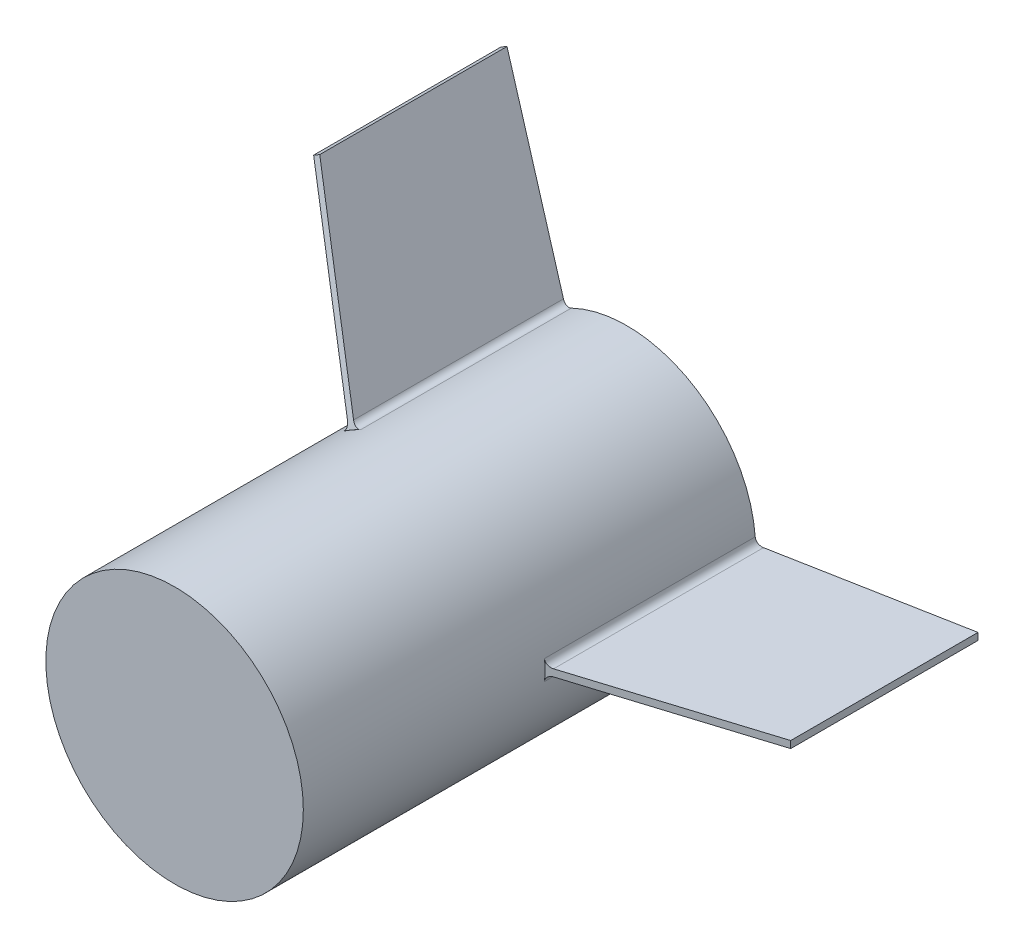
ISO-10303-21;
HEADER;
FILE_DESCRIPTION(('STEP AP214'),'2;1');
FILE_NAME('part.step','',(''),(''),'','','');
FILE_SCHEMA(('AUTOMOTIVE_DESIGN { 1 0 10303 214 1 1 1 1 }'));
ENDSEC;
DATA;
#1=APPLICATION_CONTEXT('core data for automotive mechanical design processes');
#2=APPLICATION_PROTOCOL_DEFINITION('international standard','automotive_design',2000,#1);
#3=PRODUCT_CONTEXT('',#1,'mechanical');
#4=PRODUCT('Part','Part','',(#3));
#5=PRODUCT_RELATED_PRODUCT_CATEGORY('part','',(#4));
#6=PRODUCT_DEFINITION_FORMATION('','',#4);
#7=PRODUCT_DEFINITION_CONTEXT('part definition',#1,'design');
#8=PRODUCT_DEFINITION('design','',#6,#7);
#9=PRODUCT_DEFINITION_SHAPE('','',#8);
#10=(LENGTH_UNIT() NAMED_UNIT(*) SI_UNIT(.MILLI.,.METRE.));
#11=(NAMED_UNIT(*) PLANE_ANGLE_UNIT() SI_UNIT($,.RADIAN.));
#12=(NAMED_UNIT(*) SI_UNIT($,.STERADIAN.) SOLID_ANGLE_UNIT());
#13=UNCERTAINTY_MEASURE_WITH_UNIT(LENGTH_MEASURE(1.E-05),#10,'distance_accuracy_value','');
#14=(GEOMETRIC_REPRESENTATION_CONTEXT(3) GLOBAL_UNCERTAINTY_ASSIGNED_CONTEXT((#13)) GLOBAL_UNIT_ASSIGNED_CONTEXT((#10,
#11,#12)) REPRESENTATION_CONTEXT('',''));
#15=CARTESIAN_POINT('',(0.,0.,0.));
#16=DIRECTION('',(0.,0.,1.));
#17=DIRECTION('',(1.,0.,0.));
#18=AXIS2_PLACEMENT_3D('',#15,#16,#17);
#19=CARTESIAN_POINT('',(0.,0.,190.));
#20=DIRECTION('',(0.,0.,-1.));
#21=DIRECTION('',(-1.,0.,0.));
#22=AXIS2_PLACEMENT_3D('',#19,#20,#21);
#23=CYLINDRICAL_SURFACE('',#22,55.);
#24=CARTESIAN_POINT('',(0.,0.,193.2));
#25=DIRECTION('',(0.,0.,1.));
#26=DIRECTION('',(1.,0.,0.));
#27=AXIS2_PLACEMENT_3D('',#24,#25,#26);
#28=CIRCLE('',#27,55.);
#29=CARTESIAN_POINT('',(55.,0.,193.2));
#30=VERTEX_POINT('',#29);
#31=EDGE_CURVE('E337',#30,#30,#28,.T.);
#32=ORIENTED_EDGE('',*,*,#31,.F.);
#33=EDGE_LOOP('',(#32));
#34=FACE_BOUND('',#33,.T.);
#35=CARTESIAN_POINT('',(0.,0.,0.));
#36=DIRECTION('',(0.,0.,1.));
#37=DIRECTION('',(1.,0.,0.));
#38=AXIS2_PLACEMENT_3D('',#35,#36,#37);
#39=CIRCLE('',#38,55.);
#40=CARTESIAN_POINT('',(-31.1126447334815,45.3541986776105,0.));
#41=VERTEX_POINT('',#40);
#42=CARTESIAN_POINT('',(-31.1126447334821,-45.3541986776101,0.));
#43=VERTEX_POINT('',#42);
#44=EDGE_CURVE('E368',#41,#43,#39,.T.);
#45=ORIENTED_EDGE('',*,*,#44,.T.);
#46=DIRECTION('',(0.,0.,-1.));
#47=VECTOR('',#46,1.);
#48=CARTESIAN_POINT('',(-31.1126447334821,-45.3541986776101,190.));
#49=LINE('',#48,#47);
#50=CARTESIAN_POINT('',(-31.1126447334821,-45.3541986776101,90.));
#51=VERTEX_POINT('',#50);
#52=EDGE_CURVE('E400',#43,#51,#49,.F.);
#53=ORIENTED_EDGE('',*,*,#52,.T.);
#54=CARTESIAN_POINT('',(0.,0.,90.));
#55=DIRECTION('',(0.,0.,-1.));
#56=DIRECTION('',(-1.,0.,0.));
#57=AXIS2_PLACEMENT_3D('',#54,#55,#56);
#58=CIRCLE('',#57,55.);
#59=CARTESIAN_POINT('',(-27.5000000000002,-47.631397208144,90.));
#60=VERTEX_POINT('',#59);
#61=EDGE_CURVE('E375',#60,#51,#58,.T.);
#62=ORIENTED_EDGE('',*,*,#61,.F.);
#63=CARTESIAN_POINT('',(-23.7215658563563,-49.6214400569204,90.));
#64=VERTEX_POINT('',#63);
#65=EDGE_CURVE('E378',#64,#60,#58,.T.);
#66=ORIENTED_EDGE('',*,*,#65,.F.);
#67=DIRECTION('',(0.,0.,-1.));
#68=VECTOR('',#67,1.);
#69=CARTESIAN_POINT('',(-23.7215658563563,-49.6214400569204,190.));
#70=LINE('',#69,#68);
#71=CARTESIAN_POINT('',(-23.7215658563563,-49.6214400569204,0.));
#72=VERTEX_POINT('',#71);
#73=EDGE_CURVE('E397',#64,#72,#70,.T.);
#74=ORIENTED_EDGE('',*,*,#73,.T.);
#75=CARTESIAN_POINT('',(54.834210589838,-4.26724137931035,0.));
#76=VERTEX_POINT('',#75);
#77=EDGE_CURVE('E360',#72,#76,#39,.T.);
#78=ORIENTED_EDGE('',*,*,#77,.T.);
#79=DIRECTION('',(0.,0.,-1.));
#80=VECTOR('',#79,1.);
#81=CARTESIAN_POINT('',(54.834210589838,-4.26724137931035,190.));
#82=LINE('',#81,#80);
#83=CARTESIAN_POINT('',(54.834210589838,-4.26724137931035,90.));
#84=VERTEX_POINT('',#83);
#85=EDGE_CURVE('E393',#76,#84,#82,.F.);
#86=ORIENTED_EDGE('',*,*,#85,.T.);
#87=CARTESIAN_POINT('',(0.,0.,90.));
#88=DIRECTION('',(0.,0.,-1.));
#89=DIRECTION('',(-1.,0.,0.));
#90=AXIS2_PLACEMENT_3D('',#87,#88,#89);
#91=CIRCLE('',#90,55.);
#92=CARTESIAN_POINT('',(55.,0.,90.));
#93=VERTEX_POINT('',#92);
#94=EDGE_CURVE('E346',#93,#84,#91,.T.);
#95=ORIENTED_EDGE('',*,*,#94,.F.);
#96=CARTESIAN_POINT('',(54.834210589838,4.26724137931035,90.));
#97=VERTEX_POINT('',#96);
#98=EDGE_CURVE('E374',#97,#93,#91,.T.);
#99=ORIENTED_EDGE('',*,*,#98,.F.);
#100=DIRECTION('',(0.,0.,-1.));
#101=VECTOR('',#100,1.);
#102=CARTESIAN_POINT('',(54.834210589838,4.26724137931035,190.));
#103=LINE('',#102,#101);
#104=CARTESIAN_POINT('',(54.834210589838,4.26724137931035,0.));
#105=VERTEX_POINT('',#104);
#106=EDGE_CURVE('E390',#97,#105,#103,.T.);
#107=ORIENTED_EDGE('',*,*,#106,.T.);
#108=CARTESIAN_POINT('',(-23.7215658563556,49.6214400569208,0.));
#109=VERTEX_POINT('',#108);
#110=EDGE_CURVE('E364',#105,#109,#39,.T.);
#111=ORIENTED_EDGE('',*,*,#110,.T.);
#112=DIRECTION('',(0.,0.,-1.));
#113=VECTOR('',#112,1.);
#114=CARTESIAN_POINT('',(-23.7215658563556,49.6214400569208,190.));
#115=LINE('',#114,#113);
#116=CARTESIAN_POINT('',(-23.7215658563556,49.6214400569208,90.));
#117=VERTEX_POINT('',#116);
#118=EDGE_CURVE('E386',#109,#117,#115,.F.);
#119=ORIENTED_EDGE('',*,*,#118,.T.);
#120=CARTESIAN_POINT('',(0.,0.,90.));
#121=DIRECTION('',(0.,0.,-1.));
#122=DIRECTION('',(-1.,0.,0.));
#123=AXIS2_PLACEMENT_3D('',#120,#121,#122);
#124=CIRCLE('',#123,55.);
#125=CARTESIAN_POINT('',(-27.4999999999996,47.6313972081444,90.));
#126=VERTEX_POINT('',#125);
#127=EDGE_CURVE('E379',#126,#117,#124,.T.);
#128=ORIENTED_EDGE('',*,*,#127,.F.);
#129=CARTESIAN_POINT('',(-31.1126447334815,45.3541986776105,90.));
#130=VERTEX_POINT('',#129);
#131=EDGE_CURVE('E382',#130,#126,#124,.T.);
#132=ORIENTED_EDGE('',*,*,#131,.F.);
#133=DIRECTION('',(0.,0.,-1.));
#134=VECTOR('',#133,1.);
#135=CARTESIAN_POINT('',(-31.1126447334815,45.3541986776105,190.));
#136=LINE('',#135,#134);
#137=EDGE_CURVE('E383',#130,#41,#136,.T.);
#138=ORIENTED_EDGE('',*,*,#137,.T.);
#139=EDGE_LOOP('',(#45,#53,#62,#66,#74,#78,#86,#95,#99,#107,#111,#119,#128,#132,#138));
#140=FACE_BOUND('',#139,.T.);
#141=ADVANCED_FACE('F46',(#34,#140),#23,.T.);
#142=CARTESIAN_POINT('',(0.,0.,10.));
#143=DIRECTION('',(0.,0.,-1.));
#144=DIRECTION('',(-1.,0.,0.));
#145=AXIS2_PLACEMENT_3D('',#142,#143,#144);
#146=CYLINDRICAL_SURFACE('',#145,15.);
#147=CARTESIAN_POINT('',(0.,0.,0.));
#148=DIRECTION('',(0.,0.,-1.));
#149=DIRECTION('',(-1.,0.,0.));
#150=AXIS2_PLACEMENT_3D('',#147,#148,#149);
#151=CIRCLE('',#150,15.);
#152=CARTESIAN_POINT('',(-15.,0.,0.));
#153=VERTEX_POINT('',#152);
#154=EDGE_CURVE('E352',#153,#153,#151,.T.);
#155=ORIENTED_EDGE('',*,*,#154,.T.);
#156=EDGE_LOOP('',(#155));
#157=FACE_BOUND('',#156,.T.);
#158=CARTESIAN_POINT('',(0.,0.,190.));
#159=DIRECTION('',(0.,0.,1.));
#160=DIRECTION('',(1.,0.,0.));
#161=AXIS2_PLACEMENT_3D('',#158,#159,#160);
#162=CIRCLE('',#161,15.);
#163=CARTESIAN_POINT('',(15.,0.,190.));
#164=VERTEX_POINT('',#163);
#165=EDGE_CURVE('E342',#164,#164,#162,.F.);
#166=ORIENTED_EDGE('',*,*,#165,.F.);
#167=EDGE_LOOP('',(#166));
#168=FACE_BOUND('',#167,.T.);
#169=ADVANCED_FACE('F607',(#157,#168),#146,.F.);
#170=CARTESIAN_POINT('',(0.,0.,0.));
#171=DIRECTION('',(0.,0.,1.));
#172=DIRECTION('',(1.,0.,0.));
#173=AXIS2_PLACEMENT_3D('',#170,#171,#172);
#174=PLANE('',#173);
#175=ORIENTED_EDGE('',*,*,#44,.F.);
#176=CARTESIAN_POINT('',(-32.8096980825805,47.8280640600256,0.));
#177=DIRECTION('',(0.,0.,1.));
#178=DIRECTION('',(1.,0.,0.));
#179=AXIS2_PLACEMENT_3D('',#176,#177,#178);
#180=CIRCLE('',#179,3.);
#181=CARTESIAN_POINT('',(-30.5231456013962,45.8859832813786,0.));
#182=VERTEX_POINT('',#181);
#183=EDGE_CURVE('E56',#41,#182,#180,.T.);
#184=ORIENTED_EDGE('',*,*,#183,.T.);
#185=DIRECTION('',(0.866025403784443,0.499999999999992,0.));
#186=VECTOR('',#185,1.);
#187=CARTESIAN_POINT('',(-28.7990381056762,46.8813972081444,0.));
#188=LINE('',#187,#186);
#189=CARTESIAN_POINT('',(-24.4768543986029,49.3768111349101,0.));
#190=VERTEX_POINT('',#189);
#191=EDGE_CURVE('E62',#182,#190,#188,.T.);
#192=ORIENTED_EDGE('',*,*,#191,.T.);
#193=CARTESIAN_POINT('',(-25.0154694485205,52.3280640600255,0.));
#194=DIRECTION('',(0.,0.,1.));
#195=DIRECTION('',(1.,0.,0.));
#196=AXIS2_PLACEMENT_3D('',#193,#194,#195);
#197=CIRCLE('',#196,3.);
#198=EDGE_CURVE('E491',#190,#109,#197,.T.);
#199=ORIENTED_EDGE('',*,*,#198,.T.);
#200=ORIENTED_EDGE('',*,*,#110,.F.);
#201=CARTESIAN_POINT('',(57.8251675311019,4.5,0.));
#202=DIRECTION('',(0.,0.,1.));
#203=DIRECTION('',(1.,0.,0.));
#204=AXIS2_PLACEMENT_3D('',#201,#202,#203);
#205=CIRCLE('',#204,3.);
#206=CARTESIAN_POINT('',(55.,3.49082785353159,0.));
#207=VERTEX_POINT('',#206);
#208=EDGE_CURVE('E474',#105,#207,#205,.T.);
#209=ORIENTED_EDGE('',*,*,#208,.T.);
#210=DIRECTION('',(0.,-1.,0.));
#211=VECTOR('',#210,1.);
#212=CARTESIAN_POINT('',(55.,1.5,0.));
#213=LINE('',#212,#211);
#214=CARTESIAN_POINT('',(55.,-3.49082785353159,0.));
#215=VERTEX_POINT('',#214);
#216=EDGE_CURVE('E313',#207,#215,#213,.T.);
#217=ORIENTED_EDGE('',*,*,#216,.T.);
#218=CARTESIAN_POINT('',(57.8251675311019,-4.5,0.));
#219=DIRECTION('',(0.,0.,1.));
#220=DIRECTION('',(1.,0.,0.));
#221=AXIS2_PLACEMENT_3D('',#218,#219,#220);
#222=CIRCLE('',#221,3.);
#223=EDGE_CURVE('E463',#215,#76,#222,.T.);
#224=ORIENTED_EDGE('',*,*,#223,.T.);
#225=ORIENTED_EDGE('',*,*,#77,.F.);
#226=CARTESIAN_POINT('',(-25.0154694485212,-52.3280640600252,0.));
#227=DIRECTION('',(0.,0.,1.));
#228=DIRECTION('',(1.,0.,0.));
#229=AXIS2_PLACEMENT_3D('',#226,#227,#228);
#230=CIRCLE('',#229,3.);
#231=CARTESIAN_POINT('',(-24.4768543986036,-49.3768111349098,0.));
#232=VERTEX_POINT('',#231);
#233=EDGE_CURVE('E445',#72,#232,#230,.T.);
#234=ORIENTED_EDGE('',*,*,#233,.T.);
#235=DIRECTION('',(-0.866025403784436,0.500000000000004,0.));
#236=VECTOR('',#235,1.);
#237=CARTESIAN_POINT('',(-26.2009618943236,-48.381397208144,0.));
#238=LINE('',#237,#236);
#239=CARTESIAN_POINT('',(-30.5231456013968,-45.8859832813782,0.));
#240=VERTEX_POINT('',#239);
#241=EDGE_CURVE('E277',#232,#240,#238,.T.);
#242=ORIENTED_EDGE('',*,*,#241,.T.);
#243=CARTESIAN_POINT('',(-32.8096980825811,-47.8280640600252,0.));
#244=DIRECTION('',(0.,0.,1.));
#245=DIRECTION('',(1.,0.,0.));
#246=AXIS2_PLACEMENT_3D('',#243,#244,#245);
#247=CIRCLE('',#246,3.);
#248=EDGE_CURVE('E434',#240,#43,#247,.T.);
#249=ORIENTED_EDGE('',*,*,#248,.T.);
#250=EDGE_LOOP('',(#175,#184,#192,#199,#200,#209,#217,#224,#225,#234,#242,#249));
#251=FACE_BOUND('',#250,.T.);
#252=ORIENTED_EDGE('',*,*,#154,.F.);
#253=EDGE_LOOP('',(#252));
#254=FACE_BOUND('',#253,.T.);
#255=ADVANCED_FACE('F504',(#251,#254),#174,.F.);
#256=CARTESIAN_POINT('',(0.,0.,190.));
#257=DIRECTION('',(0.,0.,1.));
#258=DIRECTION('',(1.,0.,0.));
#259=AXIS2_PLACEMENT_3D('',#256,#257,#258);
#260=PLANE('',#259);
#261=ORIENTED_EDGE('',*,*,#165,.T.);
#262=EDGE_LOOP('',(#261));
#263=FACE_BOUND('',#262,.T.);
#264=ADVANCED_FACE('F642',(#263),#260,.F.);
#265=CARTESIAN_POINT('',(0.,0.,193.2));
#266=DIRECTION('',(0.,0.,1.));
#267=DIRECTION('',(1.,0.,0.));
#268=AXIS2_PLACEMENT_3D('',#265,#266,#267);
#269=PLANE('',#268);
#270=ORIENTED_EDGE('',*,*,#31,.T.);
#271=EDGE_LOOP('',(#270));
#272=FACE_BOUND('',#271,.T.);
#273=ADVANCED_FACE('F736',(#272),#269,.T.);
#274=CARTESIAN_POINT('',(55.,1.5,90.));
#275=DIRECTION('',(0.,0.,-1.));
#276=DIRECTION('',(-1.,0.,0.));
#277=AXIS2_PLACEMENT_3D('',#274,#275,#276);
#278=PLANE('',#277);
#279=DIRECTION('',(0.,-1.,0.));
#280=VECTOR('',#279,1.);
#281=CARTESIAN_POINT('',(55.,1.5,90.));
#282=LINE('',#281,#280);
#283=CARTESIAN_POINT('',(55.,3.49082785353156,90.));
#284=VERTEX_POINT('',#283);
#285=EDGE_CURVE('E333',#284,#93,#282,.T.);
#286=ORIENTED_EDGE('',*,*,#285,.F.);
#287=CARTESIAN_POINT('',(57.8251675311019,4.5,90.));
#288=DIRECTION('',(0.,0.,-1.));
#289=DIRECTION('',(-1.,0.,0.));
#290=AXIS2_PLACEMENT_3D('',#287,#288,#289);
#291=CIRCLE('',#290,3.);
#292=EDGE_CURVE('E470',#284,#97,#291,.T.);
#293=ORIENTED_EDGE('',*,*,#292,.T.);
#294=ORIENTED_EDGE('',*,*,#98,.T.);
#295=EDGE_LOOP('',(#286,#293,#294));
#296=FACE_BOUND('',#295,.T.);
#297=ADVANCED_FACE('F730',(#296),#278,.F.);
#298=CARTESIAN_POINT('',(0.,1.5,0.));
#299=DIRECTION('',(0.,-1.,0.));
#300=DIRECTION('',(0.,0.,-1.));
#301=AXIS2_PLACEMENT_3D('',#298,#299,#300);
#302=PLANE('',#301);
#303=DIRECTION('',(-0.982872186934322,0.,0.184288535050185));
#304=VECTOR('',#303,1.);
#305=CARTESIAN_POINT('',(135.,1.5,-15.));
#306=LINE('',#305,#304);
#307=CARTESIAN_POINT('',(135.,1.5,-15.));
#308=VERTEX_POINT('',#307);
#309=CARTESIAN_POINT('',(57.8251675311019,1.5,-0.529718912081608));
#310=VERTEX_POINT('',#309);
#311=EDGE_CURVE('E309',#308,#310,#306,.T.);
#312=ORIENTED_EDGE('',*,*,#311,.T.);
#313=DIRECTION('',(0.,0.,1.));
#314=VECTOR('',#313,1.);
#315=CARTESIAN_POINT('',(57.8251675311019,1.5,90.));
#316=LINE('',#315,#314);
#317=CARTESIAN_POINT('',(57.8251675311019,1.5,89.1171351465307));
#318=VERTEX_POINT('',#317);
#319=EDGE_CURVE('E414',#310,#318,#316,.T.);
#320=ORIENTED_EDGE('',*,*,#319,.T.);
#321=DIRECTION('',(0.95447997803503,0.,-0.298274993135947));
#322=VECTOR('',#321,1.);
#323=CARTESIAN_POINT('',(55.,1.5,90.));
#324=LINE('',#323,#322);
#325=CARTESIAN_POINT('',(135.,1.5,65.));
#326=VERTEX_POINT('',#325);
#327=EDGE_CURVE('E302',#318,#326,#324,.T.);
#328=ORIENTED_EDGE('',*,*,#327,.T.);
#329=DIRECTION('',(0.,0.,-1.));
#330=VECTOR('',#329,1.);
#331=CARTESIAN_POINT('',(135.,1.5,65.));
#332=LINE('',#331,#330);
#333=EDGE_CURVE('E305',#326,#308,#332,.T.);
#334=ORIENTED_EDGE('',*,*,#333,.T.);
#335=EDGE_LOOP('',(#312,#320,#328,#334));
#336=FACE_BOUND('',#335,.T.);
#337=ADVANCED_FACE('F735',(#336),#302,.F.);
#338=CARTESIAN_POINT('',(0.,-1.5,0.));
#339=DIRECTION('',(0.,-1.,0.));
#340=DIRECTION('',(0.,0.,-1.));
#341=AXIS2_PLACEMENT_3D('',#338,#339,#340);
#342=PLANE('',#341);
#343=DIRECTION('',(0.95447997803503,0.,-0.298274993135947));
#344=VECTOR('',#343,1.);
#345=CARTESIAN_POINT('',(55.,-1.5,90.));
#346=LINE('',#345,#344);
#347=CARTESIAN_POINT('',(57.8251675311019,-1.5,89.1171351465307));
#348=VERTEX_POINT('',#347);
#349=CARTESIAN_POINT('',(135.,-1.5,65.));
#350=VERTEX_POINT('',#349);
#351=EDGE_CURVE('E301',#348,#350,#346,.T.);
#352=ORIENTED_EDGE('',*,*,#351,.F.);
#353=DIRECTION('',(0.,0.,-1.));
#354=VECTOR('',#353,1.);
#355=CARTESIAN_POINT('',(57.8251675311019,-1.5,0.));
#356=LINE('',#355,#354);
#357=CARTESIAN_POINT('',(57.8251675311019,-1.5,-0.529718912081608));
#358=VERTEX_POINT('',#357);
#359=EDGE_CURVE('E411',#348,#358,#356,.T.);
#360=ORIENTED_EDGE('',*,*,#359,.T.);
#361=DIRECTION('',(-0.982872186934322,0.,0.184288535050185));
#362=VECTOR('',#361,1.);
#363=CARTESIAN_POINT('',(135.,-1.5,-15.));
#364=LINE('',#363,#362);
#365=CARTESIAN_POINT('',(135.,-1.5,-15.));
#366=VERTEX_POINT('',#365);
#367=EDGE_CURVE('E306',#366,#358,#364,.T.);
#368=ORIENTED_EDGE('',*,*,#367,.F.);
#369=DIRECTION('',(0.,0.,-1.));
#370=VECTOR('',#369,1.);
#371=CARTESIAN_POINT('',(135.,-1.5,65.));
#372=LINE('',#371,#370);
#373=EDGE_CURVE('E316',#350,#366,#372,.T.);
#374=ORIENTED_EDGE('',*,*,#373,.F.);
#375=EDGE_LOOP('',(#352,#360,#368,#374));
#376=FACE_BOUND('',#375,.T.);
#377=ADVANCED_FACE('F750',(#376),#342,.T.);
#378=CARTESIAN_POINT('',(55.,-3.49082785353156,90.));
#379=VERTEX_POINT('',#378);
#380=EDGE_CURVE('E332',#93,#379,#282,.T.);
#381=ORIENTED_EDGE('',*,*,#380,.F.);
#382=ORIENTED_EDGE('',*,*,#94,.T.);
#383=CARTESIAN_POINT('',(57.8251675311019,-4.5,90.));
#384=DIRECTION('',(0.,0.,-1.));
#385=DIRECTION('',(-1.,0.,0.));
#386=AXIS2_PLACEMENT_3D('',#383,#384,#385);
#387=CIRCLE('',#386,3.);
#388=EDGE_CURVE('E452',#84,#379,#387,.T.);
#389=ORIENTED_EDGE('',*,*,#388,.T.);
#390=EDGE_LOOP('',(#381,#382,#389));
#391=FACE_BOUND('',#390,.T.);
#392=ADVANCED_FACE('F739',(#391),#278,.F.);
#393=CARTESIAN_POINT('',(55.,1.5,90.));
#394=DIRECTION('',(-0.298274993135947,0.,-0.95447997803503));
#395=DIRECTION('',(-0.95447997803503,0.,0.298274993135947));
#396=AXIS2_PLACEMENT_3D('',#393,#394,#395);
#397=PLANE('',#396);
#398=ORIENTED_EDGE('',*,*,#380,.T.);
#399=CARTESIAN_POINT('',(57.8251675311019,-4.5,89.1171351465306));
#400=DIRECTION('',(-0.298274993135947,0.,-0.95447997803503));
#401=DIRECTION('',(0.95447997803503,0.,-0.298274993135947));
#402=AXIS2_PLACEMENT_3D('',#399,#400,#401);
#403=ELLIPSE('',#402,3.14307274017004,3.);
#404=EDGE_CURVE('E456',#379,#348,#403,.T.);
#405=ORIENTED_EDGE('',*,*,#404,.T.);
#406=ORIENTED_EDGE('',*,*,#351,.T.);
#407=DIRECTION('',(0.,-1.,0.));
#408=VECTOR('',#407,1.);
#409=CARTESIAN_POINT('',(135.,1.5,65.));
#410=LINE('',#409,#408);
#411=EDGE_CURVE('E328',#326,#350,#410,.T.);
#412=ORIENTED_EDGE('',*,*,#411,.F.);
#413=ORIENTED_EDGE('',*,*,#327,.F.);
#414=CARTESIAN_POINT('',(57.8251675311019,4.5,89.1171351465306));
#415=DIRECTION('',(-0.298274993135947,0.,-0.95447997803503));
#416=DIRECTION('',(0.95447997803503,0.,-0.298274993135947));
#417=AXIS2_PLACEMENT_3D('',#414,#415,#416);
#418=ELLIPSE('',#417,3.14307274017004,3.);
#419=EDGE_CURVE('E466',#318,#284,#418,.T.);
#420=ORIENTED_EDGE('',*,*,#419,.T.);
#421=ORIENTED_EDGE('',*,*,#285,.T.);
#422=EDGE_LOOP('',(#398,#405,#406,#412,#413,#420,#421));
#423=FACE_BOUND('',#422,.T.);
#424=ADVANCED_FACE('F678',(#423),#397,.F.);
#425=CARTESIAN_POINT('',(135.,1.5,65.));
#426=DIRECTION('',(-1.,0.,0.));
#427=DIRECTION('',(0.,0.,1.));
#428=AXIS2_PLACEMENT_3D('',#425,#426,#427);
#429=PLANE('',#428);
#430=ORIENTED_EDGE('',*,*,#373,.T.);
#431=DIRECTION('',(0.,-1.,0.));
#432=VECTOR('',#431,1.);
#433=CARTESIAN_POINT('',(135.,1.5,-15.));
#434=LINE('',#433,#432);
#435=EDGE_CURVE('E324',#308,#366,#434,.T.);
#436=ORIENTED_EDGE('',*,*,#435,.F.);
#437=ORIENTED_EDGE('',*,*,#333,.F.);
#438=ORIENTED_EDGE('',*,*,#411,.T.);
#439=EDGE_LOOP('',(#430,#436,#437,#438));
#440=FACE_BOUND('',#439,.T.);
#441=ADVANCED_FACE('F673',(#440),#429,.F.);
#442=CARTESIAN_POINT('',(135.,1.5,-15.));
#443=DIRECTION('',(0.184288535050185,0.,0.982872186934322));
#444=DIRECTION('',(0.982872186934322,0.,-0.184288535050185));
#445=AXIS2_PLACEMENT_3D('',#442,#443,#444);
#446=PLANE('',#445);
#447=ORIENTED_EDGE('',*,*,#367,.T.);
#448=CARTESIAN_POINT('',(57.8251675311019,-4.5,-0.529718912081617));
#449=DIRECTION('',(0.184288535050185,0.,0.982872186934322));
#450=DIRECTION('',(0.982872186934322,0.,-0.184288535050185));
#451=AXIS2_PLACEMENT_3D('',#448,#449,#450);
#452=ELLIPSE('',#451,3.05227886176869,3.);
#453=EDGE_CURVE('E459',#358,#215,#452,.T.);
#454=ORIENTED_EDGE('',*,*,#453,.T.);
#455=ORIENTED_EDGE('',*,*,#216,.F.);
#456=CARTESIAN_POINT('',(57.8251675311019,4.5,-0.529718912081617));
#457=DIRECTION('',(0.184288535050185,0.,0.982872186934322));
#458=DIRECTION('',(0.982872186934322,0.,-0.184288535050185));
#459=AXIS2_PLACEMENT_3D('',#456,#457,#458);
#460=ELLIPSE('',#459,3.05227886176869,3.);
#461=EDGE_CURVE('E478',#207,#310,#460,.T.);
#462=ORIENTED_EDGE('',*,*,#461,.T.);
#463=ORIENTED_EDGE('',*,*,#311,.F.);
#464=ORIENTED_EDGE('',*,*,#435,.T.);
#465=EDGE_LOOP('',(#447,#454,#455,#462,#463,#464));
#466=FACE_BOUND('',#465,.T.);
#467=ADVANCED_FACE('F537',(#466),#446,.F.);
#468=CARTESIAN_POINT('',(-26.2009618943236,-48.381397208144,90.));
#469=DIRECTION('',(0.,0.,-1.));
#470=DIRECTION('',(-1.,0.,0.));
#471=AXIS2_PLACEMENT_3D('',#468,#469,#470);
#472=PLANE('',#471);
#473=DIRECTION('',(-0.866025403784436,0.500000000000004,0.));
#474=VECTOR('',#473,1.);
#475=CARTESIAN_POINT('',(-26.2009618943236,-48.381397208144,90.));
#476=LINE('',#475,#474);
#477=CARTESIAN_POINT('',(-24.4768543986036,-49.3768111349098,90.));
#478=VERTEX_POINT('',#477);
#479=EDGE_CURVE('E297',#478,#60,#476,.T.);
#480=ORIENTED_EDGE('',*,*,#479,.F.);
#481=CARTESIAN_POINT('',(-25.0154694485212,-52.3280640600252,90.));
#482=DIRECTION('',(0.,0.,-1.));
#483=DIRECTION('',(-1.,0.,0.));
#484=AXIS2_PLACEMENT_3D('',#481,#482,#483);
#485=CIRCLE('',#484,3.);
#486=EDGE_CURVE('E441',#478,#64,#485,.T.);
#487=ORIENTED_EDGE('',*,*,#486,.T.);
#488=ORIENTED_EDGE('',*,*,#65,.T.);
#489=EDGE_LOOP('',(#480,#487,#488));
#490=FACE_BOUND('',#489,.T.);
#491=ADVANCED_FACE('F564',(#490),#472,.F.);
#492=CARTESIAN_POINT('',(1.29903810567665,-0.750000000000006,0.));
#493=DIRECTION('',(-0.866025403784436,0.500000000000004,0.));
#494=DIRECTION('',(0.,0.,-1.));
#495=AXIS2_PLACEMENT_3D('',#492,#493,#494);
#496=PLANE('',#495);
#497=DIRECTION('',(0.491436093467165,0.851192282558288,0.184288535050185));
#498=VECTOR('',#497,1.);
#499=CARTESIAN_POINT('',(-66.2009618943239,-117.663429510899,-15.));
#500=LINE('',#499,#498);
#501=CARTESIAN_POINT('',(-66.2009618943239,-117.663429510899,-15.));
#502=VERTEX_POINT('',#501);
#503=CARTESIAN_POINT('',(-27.6135456598745,-50.8280640600252,-0.529718912081601));
#504=VERTEX_POINT('',#503);
#505=EDGE_CURVE('E273',#502,#504,#500,.T.);
#506=ORIENTED_EDGE('',*,*,#505,.T.);
#507=DIRECTION('',(0.,0.,1.));
#508=VECTOR('',#507,1.);
#509=CARTESIAN_POINT('',(-27.6135456598745,-50.8280640600252,90.));
#510=LINE('',#509,#508);
#511=CARTESIAN_POINT('',(-27.6135456598745,-50.8280640600252,89.1171351465307));
#512=VERTEX_POINT('',#511);
#513=EDGE_CURVE('E407',#504,#512,#510,.T.);
#514=ORIENTED_EDGE('',*,*,#513,.T.);
#515=DIRECTION('',(-0.477239989017519,-0.826603908381947,-0.298274993135947));
#516=VECTOR('',#515,1.);
#517=CARTESIAN_POINT('',(-26.2009618943236,-48.381397208144,90.));
#518=LINE('',#517,#516);
#519=CARTESIAN_POINT('',(-66.2009618943239,-117.663429510899,65.));
#520=VERTEX_POINT('',#519);
#521=EDGE_CURVE('E266',#512,#520,#518,.T.);
#522=ORIENTED_EDGE('',*,*,#521,.T.);
#523=DIRECTION('',(0.,0.,-1.));
#524=VECTOR('',#523,1.);
#525=CARTESIAN_POINT('',(-66.2009618943239,-117.663429510899,65.));
#526=LINE('',#525,#524);
#527=EDGE_CURVE('E269',#520,#502,#526,.T.);
#528=ORIENTED_EDGE('',*,*,#527,.T.);
#529=EDGE_LOOP('',(#506,#514,#522,#528));
#530=FACE_BOUND('',#529,.T.);
#531=ADVANCED_FACE('F586',(#530),#496,.F.);
#532=CARTESIAN_POINT('',(-1.29903810567665,0.750000000000006,0.));
#533=DIRECTION('',(-0.866025403784436,0.500000000000004,0.));
#534=DIRECTION('',(0.,0.,-1.));
#535=AXIS2_PLACEMENT_3D('',#532,#533,#534);
#536=PLANE('',#535);
#537=DIRECTION('',(-0.477239989017519,-0.826603908381947,-0.298274993135947));
#538=VECTOR('',#537,1.);
#539=CARTESIAN_POINT('',(-28.7990381056769,-46.881397208144,90.));
#540=LINE('',#539,#538);
#541=CARTESIAN_POINT('',(-30.2116218712278,-49.3280640600252,89.1171351465307));
#542=VERTEX_POINT('',#541);
#543=CARTESIAN_POINT('',(-68.7990381056772,-116.163429510899,65.));
#544=VERTEX_POINT('',#543);
#545=EDGE_CURVE('E265',#542,#544,#540,.T.);
#546=ORIENTED_EDGE('',*,*,#545,.F.);
#547=DIRECTION('',(0.,0.,-1.));
#548=VECTOR('',#547,1.);
#549=CARTESIAN_POINT('',(-30.2116218712278,-49.3280640600252,0.));
#550=LINE('',#549,#548);
#551=CARTESIAN_POINT('',(-30.2116218712278,-49.3280640600252,-0.529718912081601));
#552=VERTEX_POINT('',#551);
#553=EDGE_CURVE('E404',#542,#552,#550,.T.);
#554=ORIENTED_EDGE('',*,*,#553,.T.);
#555=DIRECTION('',(0.491436093467165,0.851192282558288,0.184288535050185));
#556=VECTOR('',#555,1.);
#557=CARTESIAN_POINT('',(-68.7990381056772,-116.163429510899,-15.));
#558=LINE('',#557,#556);
#559=CARTESIAN_POINT('',(-68.7990381056772,-116.163429510899,-15.));
#560=VERTEX_POINT('',#559);
#561=EDGE_CURVE('E270',#560,#552,#558,.T.);
#562=ORIENTED_EDGE('',*,*,#561,.F.);
#563=DIRECTION('',(0.,0.,-1.));
#564=VECTOR('',#563,1.);
#565=CARTESIAN_POINT('',(-68.7990381056772,-116.163429510899,65.));
#566=LINE('',#565,#564);
#567=EDGE_CURVE('E280',#544,#560,#566,.T.);
#568=ORIENTED_EDGE('',*,*,#567,.F.);
#569=EDGE_LOOP('',(#546,#554,#562,#568));
#570=FACE_BOUND('',#569,.T.);
#571=ADVANCED_FACE('F574',(#570),#536,.T.);
#572=CARTESIAN_POINT('',(-30.5231456013968,-45.8859832813782,90.));
#573=VERTEX_POINT('',#572);
#574=EDGE_CURVE('E296',#60,#573,#476,.T.);
#575=ORIENTED_EDGE('',*,*,#574,.F.);
#576=ORIENTED_EDGE('',*,*,#61,.T.);
#577=CARTESIAN_POINT('',(-32.8096980825811,-47.8280640600252,90.));
#578=DIRECTION('',(0.,0.,-1.));
#579=DIRECTION('',(-1.,0.,0.));
#580=AXIS2_PLACEMENT_3D('',#577,#578,#579);
#581=CIRCLE('',#580,3.);
#582=EDGE_CURVE('E423',#51,#573,#581,.T.);
#583=ORIENTED_EDGE('',*,*,#582,.T.);
#584=EDGE_LOOP('',(#575,#576,#583));
#585=FACE_BOUND('',#584,.T.);
#586=ADVANCED_FACE('F560',(#585),#472,.F.);
#587=CARTESIAN_POINT('',(-26.2009618943236,-48.381397208144,90.));
#588=DIRECTION('',(0.149137496567975,0.258313721369358,-0.95447997803503));
#589=DIRECTION('',(0.,0.965275163850819,0.26123525423031));
#590=AXIS2_PLACEMENT_3D('',#587,#588,#589);
#591=PLANE('',#590);
#592=ORIENTED_EDGE('',*,*,#574,.T.);
#593=CARTESIAN_POINT('',(-32.8096980825811,-47.8280640600252,89.1171351465306));
#594=DIRECTION('',(0.149137496567975,0.258313721369358,-0.95447997803503));
#595=DIRECTION('',(-0.477239989017519,-0.826603908381947,-0.298274993135947));
#596=AXIS2_PLACEMENT_3D('',#593,#594,#595);
#597=ELLIPSE('',#596,3.14307274017004,3.);
#598=EDGE_CURVE('E427',#573,#542,#597,.T.);
#599=ORIENTED_EDGE('',*,*,#598,.T.);
#600=ORIENTED_EDGE('',*,*,#545,.T.);
#601=DIRECTION('',(-0.866025403784436,0.500000000000004,0.));
#602=VECTOR('',#601,1.);
#603=CARTESIAN_POINT('',(-66.2009618943239,-117.663429510899,65.));
#604=LINE('',#603,#602);
#605=EDGE_CURVE('E292',#520,#544,#604,.T.);
#606=ORIENTED_EDGE('',*,*,#605,.F.);
#607=ORIENTED_EDGE('',*,*,#521,.F.);
#608=CARTESIAN_POINT('',(-25.0154694485212,-52.3280640600252,89.1171351465306));
#609=DIRECTION('',(0.149137496567975,0.258313721369358,-0.95447997803503));
#610=DIRECTION('',(-0.477239989017519,-0.826603908381947,-0.298274993135947));
#611=AXIS2_PLACEMENT_3D('',#608,#609,#610);
#612=ELLIPSE('',#611,3.14307274017004,3.);
#613=EDGE_CURVE('E437',#512,#478,#612,.T.);
#614=ORIENTED_EDGE('',*,*,#613,.T.);
#615=ORIENTED_EDGE('',*,*,#479,.T.);
#616=EDGE_LOOP('',(#592,#599,#600,#606,#607,#614,#615));
#617=FACE_BOUND('',#616,.T.);
#618=ADVANCED_FACE('F578',(#617),#591,.F.);
#619=CARTESIAN_POINT('',(-66.2009618943239,-117.663429510899,65.));
#620=DIRECTION('',(0.500000000000004,0.866025403784436,0.));
#621=DIRECTION('',(-0.866025403784436,0.500000000000004,0.));
#622=AXIS2_PLACEMENT_3D('',#619,#620,#621);
#623=PLANE('',#622);
#624=ORIENTED_EDGE('',*,*,#567,.T.);
#625=DIRECTION('',(-0.866025403784436,0.500000000000004,0.));
#626=VECTOR('',#625,1.);
#627=CARTESIAN_POINT('',(-66.2009618943239,-117.663429510899,-15.));
#628=LINE('',#627,#626);
#629=EDGE_CURVE('E288',#502,#560,#628,.T.);
#630=ORIENTED_EDGE('',*,*,#629,.F.);
#631=ORIENTED_EDGE('',*,*,#527,.F.);
#632=ORIENTED_EDGE('',*,*,#605,.T.);
#633=EDGE_LOOP('',(#624,#630,#631,#632));
#634=FACE_BOUND('',#633,.T.);
#635=ADVANCED_FACE('F582',(#634),#623,.F.);
#636=CARTESIAN_POINT('',(-66.2009618943239,-117.663429510899,-15.));
#637=DIRECTION('',(-0.0921442675250933,-0.159598552979679,0.982872186934322));
#638=DIRECTION('',(0.,-0.987071517561017,-0.16028043929248));
#639=AXIS2_PLACEMENT_3D('',#636,#637,#638);
#640=PLANE('',#639);
#641=ORIENTED_EDGE('',*,*,#561,.T.);
#642=CARTESIAN_POINT('',(-32.8096980825811,-47.8280640600252,-0.529718912081617));
#643=DIRECTION('',(-0.0921442675250933,-0.159598552979679,0.982872186934322));
#644=DIRECTION('',(-0.491436093467165,-0.851192282558288,-0.184288535050185));
#645=AXIS2_PLACEMENT_3D('',#642,#643,#644);
#646=ELLIPSE('',#645,3.05227886176869,3.);
#647=EDGE_CURVE('E430',#552,#240,#646,.T.);
#648=ORIENTED_EDGE('',*,*,#647,.T.);
#649=ORIENTED_EDGE('',*,*,#241,.F.);
#650=CARTESIAN_POINT('',(-25.0154694485212,-52.3280640600252,-0.529718912081617));
#651=DIRECTION('',(-0.0921442675250933,-0.159598552979679,0.982872186934322));
#652=DIRECTION('',(-0.491436093467165,-0.851192282558288,-0.184288535050185));
#653=AXIS2_PLACEMENT_3D('',#650,#651,#652);
#654=ELLIPSE('',#653,3.05227886176869,3.);
#655=EDGE_CURVE('E449',#232,#504,#654,.T.);
#656=ORIENTED_EDGE('',*,*,#655,.T.);
#657=ORIENTED_EDGE('',*,*,#505,.F.);
#658=ORIENTED_EDGE('',*,*,#629,.T.);
#659=EDGE_LOOP('',(#641,#648,#649,#656,#657,#658));
#660=FACE_BOUND('',#659,.T.);
#661=ADVANCED_FACE('F570',(#660),#640,.F.);
#662=CARTESIAN_POINT('',(-28.7990381056762,46.8813972081444,90.));
#663=DIRECTION('',(0.,0.,-1.));
#664=DIRECTION('',(-1.,0.,0.));
#665=AXIS2_PLACEMENT_3D('',#662,#663,#664);
#666=PLANE('',#665);
#667=DIRECTION('',(0.866025403784443,0.499999999999992,0.));
#668=VECTOR('',#667,1.);
#669=CARTESIAN_POINT('',(-28.7990381056762,46.8813972081444,90.));
#670=LINE('',#669,#668);
#671=CARTESIAN_POINT('',(-30.5231456013962,45.8859832813786,90.));
#672=VERTEX_POINT('',#671);
#673=EDGE_CURVE('E70',#672,#126,#670,.T.);
#674=ORIENTED_EDGE('',*,*,#673,.F.);
#675=CARTESIAN_POINT('',(-32.8096980825805,47.8280640600256,90.));
#676=DIRECTION('',(0.,0.,-1.));
#677=DIRECTION('',(-1.,0.,0.));
#678=AXIS2_PLACEMENT_3D('',#675,#676,#677);
#679=CIRCLE('',#678,3.);
#680=EDGE_CURVE('E497',#672,#130,#679,.T.);
#681=ORIENTED_EDGE('',*,*,#680,.T.);
#682=ORIENTED_EDGE('',*,*,#131,.T.);
#683=EDGE_LOOP('',(#674,#681,#682));
#684=FACE_BOUND('',#683,.T.);
#685=ADVANCED_FACE('F594',(#684),#666,.F.);
#686=CARTESIAN_POINT('',(-1.29903810567666,-0.749999999999988,0.));
#687=DIRECTION('',(0.866025403784443,0.499999999999992,0.));
#688=DIRECTION('',(0.,0.,-1.));
#689=AXIS2_PLACEMENT_3D('',#686,#687,#688);
#690=PLANE('',#689);
#691=DIRECTION('',(0.491436093467153,-0.851192282558295,0.184288535050185));
#692=VECTOR('',#691,1.);
#693=CARTESIAN_POINT('',(-68.7990381056756,116.1634295109,-15.));
#694=LINE('',#693,#692);
#695=CARTESIAN_POINT('',(-68.7990381056756,116.1634295109,-15.));
#696=VERTEX_POINT('',#695);
#697=CARTESIAN_POINT('',(-30.2116218712272,49.3280640600256,-0.529718912081608));
#698=VERTEX_POINT('',#697);
#699=EDGE_CURVE('E246',#696,#698,#694,.T.);
#700=ORIENTED_EDGE('',*,*,#699,.T.);
#701=DIRECTION('',(0.,0.,1.));
#702=VECTOR('',#701,1.);
#703=CARTESIAN_POINT('',(-30.2116218712271,49.3280640600256,90.));
#704=LINE('',#703,#702);
#705=CARTESIAN_POINT('',(-30.2116218712271,49.3280640600256,89.1171351465307));
#706=VERTEX_POINT('',#705);
#707=EDGE_CURVE('E226',#698,#706,#704,.T.);
#708=ORIENTED_EDGE('',*,*,#707,.T.);
#709=DIRECTION('',(-0.477239989017507,0.826603908381953,-0.298274993135947));
#710=VECTOR('',#709,1.);
#711=CARTESIAN_POINT('',(-28.7990381056762,46.8813972081444,90.));
#712=LINE('',#711,#710);
#713=CARTESIAN_POINT('',(-68.7990381056756,116.1634295109,65.));
#714=VERTEX_POINT('',#713);
#715=EDGE_CURVE('E218',#706,#714,#712,.T.);
#716=ORIENTED_EDGE('',*,*,#715,.T.);
#717=DIRECTION('',(0.,0.,-1.));
#718=VECTOR('',#717,1.);
#719=CARTESIAN_POINT('',(-68.7990381056756,116.1634295109,65.));
#720=LINE('',#719,#718);
#721=EDGE_CURVE('E223',#714,#696,#720,.T.);
#722=ORIENTED_EDGE('',*,*,#721,.T.);
#723=EDGE_LOOP('',(#700,#708,#716,#722));
#724=FACE_BOUND('',#723,.T.);
#725=ADVANCED_FACE('F221',(#724),#690,.F.);
#726=CARTESIAN_POINT('',(1.29903810567666,0.749999999999988,0.));
#727=DIRECTION('',(0.866025403784443,0.499999999999992,0.));
#728=DIRECTION('',(0.,0.,-1.));
#729=AXIS2_PLACEMENT_3D('',#726,#727,#728);
#730=PLANE('',#729);
#731=DIRECTION('',(-0.477239989017507,0.826603908381953,-0.298274993135947));
#732=VECTOR('',#731,1.);
#733=CARTESIAN_POINT('',(-26.2009618943229,48.3813972081444,90.));
#734=LINE('',#733,#732);
#735=CARTESIAN_POINT('',(-27.6135456598738,50.8280640600256,89.1171351465307));
#736=VERTEX_POINT('',#735);
#737=CARTESIAN_POINT('',(-66.2009618943223,117.6634295109,65.));
#738=VERTEX_POINT('',#737);
#739=EDGE_CURVE('E235',#736,#738,#734,.T.);
#740=ORIENTED_EDGE('',*,*,#739,.F.);
#741=DIRECTION('',(0.,0.,-1.));
#742=VECTOR('',#741,1.);
#743=CARTESIAN_POINT('',(-27.6135456598738,50.8280640600256,0.));
#744=LINE('',#743,#742);
#745=CARTESIAN_POINT('',(-27.6135456598738,50.8280640600256,-0.529718912081608));
#746=VERTEX_POINT('',#745);
#747=EDGE_CURVE('E418',#736,#746,#744,.T.);
#748=ORIENTED_EDGE('',*,*,#747,.T.);
#749=DIRECTION('',(0.491436093467153,-0.851192282558295,0.184288535050185));
#750=VECTOR('',#749,1.);
#751=CARTESIAN_POINT('',(-66.2009618943223,117.6634295109,-15.));
#752=LINE('',#751,#750);
#753=CARTESIAN_POINT('',(-66.2009618943223,117.6634295109,-15.));
#754=VERTEX_POINT('',#753);
#755=EDGE_CURVE('E229',#754,#746,#752,.T.);
#756=ORIENTED_EDGE('',*,*,#755,.F.);
#757=DIRECTION('',(0.,0.,-1.));
#758=VECTOR('',#757,1.);
#759=CARTESIAN_POINT('',(-66.2009618943223,117.6634295109,65.));
#760=LINE('',#759,#758);
#761=EDGE_CURVE('E253',#738,#754,#760,.T.);
#762=ORIENTED_EDGE('',*,*,#761,.F.);
#763=EDGE_LOOP('',(#740,#748,#756,#762));
#764=FACE_BOUND('',#763,.T.);
#765=ADVANCED_FACE('F513',(#764),#730,.T.);
#766=CARTESIAN_POINT('',(-24.4768543986029,49.3768111349101,90.));
#767=VERTEX_POINT('',#766);
#768=EDGE_CURVE('E239',#126,#767,#670,.T.);
#769=ORIENTED_EDGE('',*,*,#768,.F.);
#770=ORIENTED_EDGE('',*,*,#127,.T.);
#771=CARTESIAN_POINT('',(-25.0154694485205,52.3280640600255,90.));
#772=DIRECTION('',(0.,0.,-1.));
#773=DIRECTION('',(-1.,0.,0.));
#774=AXIS2_PLACEMENT_3D('',#771,#772,#773);
#775=CIRCLE('',#774,3.);
#776=EDGE_CURVE('E481',#117,#767,#775,.T.);
#777=ORIENTED_EDGE('',*,*,#776,.T.);
#778=EDGE_LOOP('',(#769,#770,#777));
#779=FACE_BOUND('',#778,.T.);
#780=ADVANCED_FACE('F591',(#779),#666,.F.);
#781=CARTESIAN_POINT('',(-28.7990381056762,46.8813972081444,90.));
#782=DIRECTION('',(0.149137496567971,-0.25831372136936,-0.95447997803503));
#783=DIRECTION('',(0.,0.965275163850818,-0.261235254230312));
#784=AXIS2_PLACEMENT_3D('',#781,#782,#783);
#785=PLANE('',#784);
#786=ORIENTED_EDGE('',*,*,#768,.T.);
#787=CARTESIAN_POINT('',(-25.0154694485205,52.3280640600255,89.1171351465306));
#788=DIRECTION('',(0.149137496567971,-0.25831372136936,-0.95447997803503));
#789=DIRECTION('',(-0.477239989017507,0.826603908381953,-0.298274993135947));
#790=AXIS2_PLACEMENT_3D('',#787,#788,#789);
#791=ELLIPSE('',#790,3.14307274017004,3.);
#792=EDGE_CURVE('E485',#767,#736,#791,.T.);
#793=ORIENTED_EDGE('',*,*,#792,.T.);
#794=ORIENTED_EDGE('',*,*,#739,.T.);
#795=DIRECTION('',(0.866025403784443,0.499999999999992,0.));
#796=VECTOR('',#795,1.);
#797=CARTESIAN_POINT('',(-68.7990381056756,116.1634295109,65.));
#798=LINE('',#797,#796);
#799=EDGE_CURVE('E232',#714,#738,#798,.T.);
#800=ORIENTED_EDGE('',*,*,#799,.F.);
#801=ORIENTED_EDGE('',*,*,#715,.F.);
#802=CARTESIAN_POINT('',(-32.8096980825805,47.8280640600256,89.1171351465306));
#803=DIRECTION('',(0.149137496567971,-0.25831372136936,-0.95447997803503));
#804=DIRECTION('',(-0.477239989017507,0.826603908381953,-0.298274993135947));
#805=AXIS2_PLACEMENT_3D('',#802,#803,#804);
#806=ELLIPSE('',#805,3.14307274017004,3.);
#807=EDGE_CURVE('E494',#706,#672,#806,.T.);
#808=ORIENTED_EDGE('',*,*,#807,.T.);
#809=ORIENTED_EDGE('',*,*,#673,.T.);
#810=EDGE_LOOP('',(#786,#793,#794,#800,#801,#808,#809));
#811=FACE_BOUND('',#810,.T.);
#812=ADVANCED_FACE('F233',(#811),#785,.F.);
#813=CARTESIAN_POINT('',(-68.7990381056756,116.1634295109,65.));
#814=DIRECTION('',(0.499999999999992,-0.866025403784443,0.));
#815=DIRECTION('',(0.866025403784443,0.499999999999992,0.));
#816=AXIS2_PLACEMENT_3D('',#813,#814,#815);
#817=PLANE('',#816);
#818=ORIENTED_EDGE('',*,*,#761,.T.);
#819=DIRECTION('',(0.866025403784443,0.499999999999992,0.));
#820=VECTOR('',#819,1.);
#821=CARTESIAN_POINT('',(-68.7990381056756,116.1634295109,-15.));
#822=LINE('',#821,#820);
#823=EDGE_CURVE('E240',#696,#754,#822,.T.);
#824=ORIENTED_EDGE('',*,*,#823,.F.);
#825=ORIENTED_EDGE('',*,*,#721,.F.);
#826=ORIENTED_EDGE('',*,*,#799,.T.);
#827=EDGE_LOOP('',(#818,#824,#825,#826));
#828=FACE_BOUND('',#827,.T.);
#829=ADVANCED_FACE('F242',(#828),#817,.F.);
#830=CARTESIAN_POINT('',(-68.7990381056756,116.1634295109,-15.));
#831=DIRECTION('',(-0.0921442675250911,0.15959855297968,0.982872186934322));
#832=DIRECTION('',(0.,-0.987071517561017,0.160280439292482));
#833=AXIS2_PLACEMENT_3D('',#830,#831,#832);
#834=PLANE('',#833);
#835=ORIENTED_EDGE('',*,*,#755,.T.);
#836=CARTESIAN_POINT('',(-25.0154694485205,52.3280640600255,-0.529718912081617));
#837=DIRECTION('',(-0.0921442675250911,0.15959855297968,0.982872186934322));
#838=DIRECTION('',(-0.491436093467153,0.851192282558295,-0.184288535050185));
#839=AXIS2_PLACEMENT_3D('',#836,#837,#838);
#840=ELLIPSE('',#839,3.0522788617687,3.);
#841=EDGE_CURVE('E488',#746,#190,#840,.T.);
#842=ORIENTED_EDGE('',*,*,#841,.T.);
#843=ORIENTED_EDGE('',*,*,#191,.F.);
#844=CARTESIAN_POINT('',(-32.8096980825805,47.8280640600256,-0.529718912081617));
#845=DIRECTION('',(-0.0921442675250911,0.15959855297968,0.982872186934322));
#846=DIRECTION('',(-0.491436093467153,0.851192282558295,-0.184288535050185));
#847=AXIS2_PLACEMENT_3D('',#844,#845,#846);
#848=ELLIPSE('',#847,3.0522788617687,3.);
#849=EDGE_CURVE('E11',#182,#698,#848,.T.);
#850=ORIENTED_EDGE('',*,*,#849,.T.);
#851=ORIENTED_EDGE('',*,*,#699,.F.);
#852=ORIENTED_EDGE('',*,*,#823,.T.);
#853=EDGE_LOOP('',(#835,#842,#843,#850,#851,#852));
#854=FACE_BOUND('',#853,.T.);
#855=ADVANCED_FACE('F509',(#854),#834,.F.);
#856=CARTESIAN_POINT('',(-32.8096980825811,-47.8280640600252,190.));
#857=DIRECTION('',(0.,0.,-1.));
#858=DIRECTION('',(-1.,0.,0.));
#859=AXIS2_PLACEMENT_3D('',#856,#857,#858);
#860=CYLINDRICAL_SURFACE('',#859,3.);
#861=ORIENTED_EDGE('',*,*,#647,.F.);
#862=ORIENTED_EDGE('',*,*,#553,.F.);
#863=ORIENTED_EDGE('',*,*,#598,.F.);
#864=ORIENTED_EDGE('',*,*,#582,.F.);
#865=ORIENTED_EDGE('',*,*,#52,.F.);
#866=ORIENTED_EDGE('',*,*,#248,.F.);
#867=EDGE_LOOP('',(#861,#862,#863,#864,#865,#866));
#868=FACE_BOUND('',#867,.T.);
#869=ADVANCED_FACE('F555',(#868),#860,.F.);
#870=CARTESIAN_POINT('',(-25.0154694485212,-52.3280640600252,190.));
#871=DIRECTION('',(0.,0.,-1.));
#872=DIRECTION('',(-1.,0.,0.));
#873=AXIS2_PLACEMENT_3D('',#870,#871,#872);
#874=CYLINDRICAL_SURFACE('',#873,3.);
#875=ORIENTED_EDGE('',*,*,#233,.F.);
#876=ORIENTED_EDGE('',*,*,#73,.F.);
#877=ORIENTED_EDGE('',*,*,#486,.F.);
#878=ORIENTED_EDGE('',*,*,#613,.F.);
#879=ORIENTED_EDGE('',*,*,#513,.F.);
#880=ORIENTED_EDGE('',*,*,#655,.F.);
#881=EDGE_LOOP('',(#875,#876,#877,#878,#879,#880));
#882=FACE_BOUND('',#881,.T.);
#883=ADVANCED_FACE('F566',(#882),#874,.F.);
#884=CARTESIAN_POINT('',(57.8251675311019,-4.5,190.));
#885=DIRECTION('',(0.,0.,-1.));
#886=DIRECTION('',(-1.,0.,0.));
#887=AXIS2_PLACEMENT_3D('',#884,#885,#886);
#888=CYLINDRICAL_SURFACE('',#887,3.);
#889=ORIENTED_EDGE('',*,*,#453,.F.);
#890=ORIENTED_EDGE('',*,*,#359,.F.);
#891=ORIENTED_EDGE('',*,*,#404,.F.);
#892=ORIENTED_EDGE('',*,*,#388,.F.);
#893=ORIENTED_EDGE('',*,*,#85,.F.);
#894=ORIENTED_EDGE('',*,*,#223,.F.);
#895=EDGE_LOOP('',(#889,#890,#891,#892,#893,#894));
#896=FACE_BOUND('',#895,.T.);
#897=ADVANCED_FACE('F542',(#896),#888,.F.);
#898=CARTESIAN_POINT('',(57.8251675311019,4.5,190.));
#899=DIRECTION('',(0.,0.,-1.));
#900=DIRECTION('',(-1.,0.,0.));
#901=AXIS2_PLACEMENT_3D('',#898,#899,#900);
#902=CYLINDRICAL_SURFACE('',#901,3.);
#903=ORIENTED_EDGE('',*,*,#208,.F.);
#904=ORIENTED_EDGE('',*,*,#106,.F.);
#905=ORIENTED_EDGE('',*,*,#292,.F.);
#906=ORIENTED_EDGE('',*,*,#419,.F.);
#907=ORIENTED_EDGE('',*,*,#319,.F.);
#908=ORIENTED_EDGE('',*,*,#461,.F.);
#909=EDGE_LOOP('',(#903,#904,#905,#906,#907,#908));
#910=FACE_BOUND('',#909,.T.);
#911=ADVANCED_FACE('F529',(#910),#902,.F.);
#912=CARTESIAN_POINT('',(-25.0154694485205,52.3280640600255,190.));
#913=DIRECTION('',(0.,0.,-1.));
#914=DIRECTION('',(-1.,0.,0.));
#915=AXIS2_PLACEMENT_3D('',#912,#913,#914);
#916=CYLINDRICAL_SURFACE('',#915,3.);
#917=ORIENTED_EDGE('',*,*,#841,.F.);
#918=ORIENTED_EDGE('',*,*,#747,.F.);
#919=ORIENTED_EDGE('',*,*,#792,.F.);
#920=ORIENTED_EDGE('',*,*,#776,.F.);
#921=ORIENTED_EDGE('',*,*,#118,.F.);
#922=ORIENTED_EDGE('',*,*,#198,.F.);
#923=EDGE_LOOP('',(#917,#918,#919,#920,#921,#922));
#924=FACE_BOUND('',#923,.T.);
#925=ADVANCED_FACE('F517',(#924),#916,.F.);
#926=CARTESIAN_POINT('',(-32.8096980825805,47.8280640600256,190.));
#927=DIRECTION('',(0.,0.,-1.));
#928=DIRECTION('',(-1.,0.,0.));
#929=AXIS2_PLACEMENT_3D('',#926,#927,#928);
#930=CYLINDRICAL_SURFACE('',#929,3.);
#931=ORIENTED_EDGE('',*,*,#183,.F.);
#932=ORIENTED_EDGE('',*,*,#137,.F.);
#933=ORIENTED_EDGE('',*,*,#680,.F.);
#934=ORIENTED_EDGE('',*,*,#807,.F.);
#935=ORIENTED_EDGE('',*,*,#707,.F.);
#936=ORIENTED_EDGE('',*,*,#849,.F.);
#937=EDGE_LOOP('',(#931,#932,#933,#934,#935,#936));
#938=FACE_BOUND('',#937,.T.);
#939=ADVANCED_FACE('F48',(#938),#930,.F.);
#940=CLOSED_SHELL('',(#141,#169,#255,#264,#273,#297,#337,#377,#392,#424,#441,#467,#491,#531,
#571,#586,#618,#635,#661,#685,#725,#765,#780,#812,#829,#855,#869,#883,#897,#911,#925,#939));
#941=CARTESIAN_POINT('',(0.,0.,190.));
#942=DIRECTION('',(0.,0.,1.));
#943=DIRECTION('',(1.,0.,0.));
#944=AXIS2_PLACEMENT_3D('',#941,#942,#943);
#945=CIRCLE('',#944,18.2);
#946=CARTESIAN_POINT('',(18.2,0.,190.));
#947=VERTEX_POINT('',#946);
#948=EDGE_CURVE('E347',#947,#947,#945,.T.);
#949=ORIENTED_EDGE('',*,*,#948,.T.);
#950=EDGE_LOOP('',(#949));
#951=FACE_BOUND('',#950,.T.);
#952=CARTESIAN_POINT('',(0.,0.,190.));
#953=DIRECTION('',(0.,0.,1.));
#954=DIRECTION('',(1.,0.,0.));
#955=AXIS2_PLACEMENT_3D('',#952,#953,#954);
#956=CIRCLE('',#955,51.8);
#957=CARTESIAN_POINT('',(51.8,0.,190.));
#958=VERTEX_POINT('',#957);
#959=EDGE_CURVE('E341',#958,#958,#956,.T.);
#960=ORIENTED_EDGE('',*,*,#959,.F.);
#961=EDGE_LOOP('',(#960));
#962=FACE_BOUND('',#961,.T.);
#963=ADVANCED_FACE('F635',(#951,#962),#260,.F.);
#964=CARTESIAN_POINT('',(0.,0.,3.19999999999998));
#965=DIRECTION('',(0.,0.,1.));
#966=DIRECTION('',(1.,0.,0.));
#967=AXIS2_PLACEMENT_3D('',#964,#965,#966);
#968=CYLINDRICAL_SURFACE('',#967,51.8);
#969=CARTESIAN_POINT('',(0.,0.,3.19999999999998));
#970=DIRECTION('',(0.,0.,1.));
#971=DIRECTION('',(1.,0.,0.));
#972=AXIS2_PLACEMENT_3D('',#969,#970,#971);
#973=CIRCLE('',#972,51.8);
#974=CARTESIAN_POINT('',(51.8,0.,3.19999999999998));
#975=VERTEX_POINT('',#974);
#976=EDGE_CURVE('E356',#975,#975,#973,.T.);
#977=ORIENTED_EDGE('',*,*,#976,.F.);
#978=EDGE_LOOP('',(#977));
#979=FACE_BOUND('',#978,.T.);
#980=ORIENTED_EDGE('',*,*,#959,.T.);
#981=EDGE_LOOP('',(#980));
#982=FACE_BOUND('',#981,.T.);
#983=ADVANCED_FACE('F639',(#979,#982),#968,.F.);
#984=CARTESIAN_POINT('',(0.,0.,3.19999999999998));
#985=DIRECTION('',(0.,0.,1.));
#986=DIRECTION('',(1.,0.,0.));
#987=AXIS2_PLACEMENT_3D('',#984,#985,#986);
#988=PLANE('',#987);
#989=ORIENTED_EDGE('',*,*,#976,.T.);
#990=EDGE_LOOP('',(#989));
#991=FACE_BOUND('',#990,.T.);
#992=CARTESIAN_POINT('',(0.,0.,3.19999999999998));
#993=DIRECTION('',(0.,0.,1.));
#994=DIRECTION('',(1.,0.,0.));
#995=AXIS2_PLACEMENT_3D('',#992,#993,#994);
#996=CIRCLE('',#995,18.2);
#997=CARTESIAN_POINT('',(18.2,0.,3.19999999999998));
#998=VERTEX_POINT('',#997);
#999=EDGE_CURVE('E348',#998,#998,#996,.T.);
#1000=ORIENTED_EDGE('',*,*,#999,.F.);
#1001=EDGE_LOOP('',(#1000));
#1002=FACE_BOUND('',#1001,.T.);
#1003=ADVANCED_FACE('F651',(#991,#1002),#988,.T.);
#1004=CARTESIAN_POINT('',(0.,0.,191.2));
#1005=DIRECTION('',(0.,0.,-1.));
#1006=DIRECTION('',(-1.,0.,0.));
#1007=AXIS2_PLACEMENT_3D('',#1004,#1005,#1006);
#1008=CYLINDRICAL_SURFACE('',#1007,18.2);
#1009=ORIENTED_EDGE('',*,*,#999,.T.);
#1010=EDGE_LOOP('',(#1009));
#1011=FACE_BOUND('',#1010,.T.);
#1012=ORIENTED_EDGE('',*,*,#948,.F.);
#1013=EDGE_LOOP('',(#1012));
#1014=FACE_BOUND('',#1013,.T.);
#1015=ADVANCED_FACE('F658',(#1011,#1014),#1008,.T.);
#1016=CLOSED_SHELL('',(#963,#983,#1003,#1015));
#1017=ORIENTED_CLOSED_SHELL('',*,#1016,.T.);
#1018=BREP_WITH_VOIDS('B2',#940,(#1017));
#1019=ADVANCED_BREP_SHAPE_REPRESENTATION('',(#18,#1018),#14);
#1020=SHAPE_DEFINITION_REPRESENTATION(#9,#1019);
ENDSEC;
END-ISO-10303-21;
